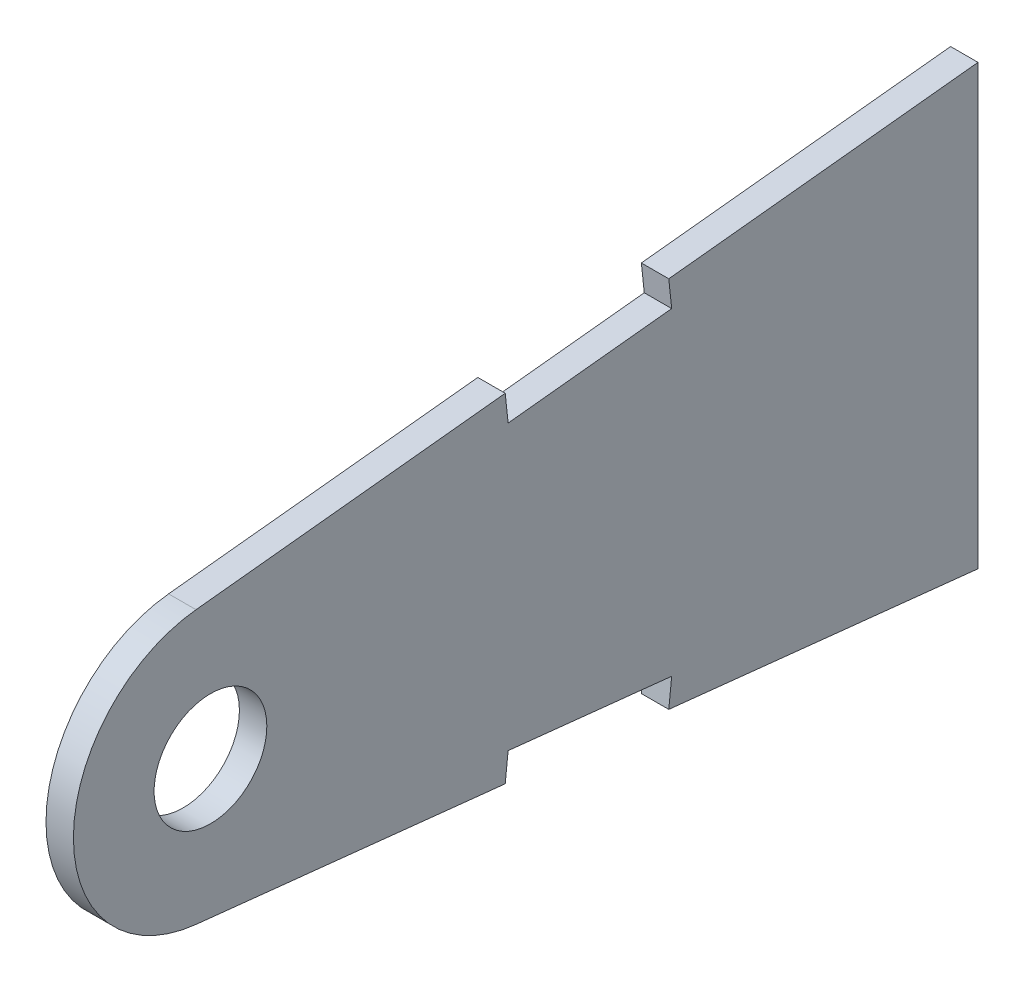
ISO-10303-21;
HEADER;
FILE_DESCRIPTION(('STEP AP214'),'2;1');
FILE_NAME('part.step','',(''),(''),'','','');
FILE_SCHEMA(('AUTOMOTIVE_DESIGN { 1 0 10303 214 1 1 1 1 }'));
ENDSEC;
DATA;
#1=APPLICATION_CONTEXT('core data for automotive mechanical design processes');
#2=APPLICATION_PROTOCOL_DEFINITION('international standard','automotive_design',2000,#1);
#3=PRODUCT_CONTEXT('',#1,'mechanical');
#4=PRODUCT('Part','Part','',(#3));
#5=PRODUCT_RELATED_PRODUCT_CATEGORY('part','',(#4));
#6=PRODUCT_DEFINITION_FORMATION('','',#4);
#7=PRODUCT_DEFINITION_CONTEXT('part definition',#1,'design');
#8=PRODUCT_DEFINITION('design','',#6,#7);
#9=PRODUCT_DEFINITION_SHAPE('','',#8);
#10=(LENGTH_UNIT() NAMED_UNIT(*) SI_UNIT(.MILLI.,.METRE.));
#11=(NAMED_UNIT(*) PLANE_ANGLE_UNIT() SI_UNIT($,.RADIAN.));
#12=(NAMED_UNIT(*) SI_UNIT($,.STERADIAN.) SOLID_ANGLE_UNIT());
#13=UNCERTAINTY_MEASURE_WITH_UNIT(LENGTH_MEASURE(1.E-05),#10,'distance_accuracy_value','');
#14=(GEOMETRIC_REPRESENTATION_CONTEXT(3) GLOBAL_UNCERTAINTY_ASSIGNED_CONTEXT((#13)) GLOBAL_UNIT_ASSIGNED_CONTEXT((#10,
#11,#12)) REPRESENTATION_CONTEXT('',''));
#15=CARTESIAN_POINT('',(0.,0.,0.));
#16=DIRECTION('',(0.,0.,1.));
#17=DIRECTION('',(1.,0.,0.));
#18=AXIS2_PLACEMENT_3D('',#15,#16,#17);
#19=CARTESIAN_POINT('',(1.5875,0.,0.));
#20=DIRECTION('',(-1.,0.,0.));
#21=DIRECTION('',(0.,0.,1.));
#22=AXIS2_PLACEMENT_3D('',#19,#20,#21);
#23=CYLINDRICAL_SURFACE('',#22,7.93750000000001);
#24=CARTESIAN_POINT('',(0.,0.,0.));
#25=DIRECTION('',(1.,0.,0.));
#26=DIRECTION('',(0.,0.,-1.));
#27=AXIS2_PLACEMENT_3D('',#24,#25,#26);
#28=CIRCLE('',#27,7.93750000000001);
#29=CARTESIAN_POINT('',(0.,7.89316367207392,0.837778906306832));
#30=VERTEX_POINT('',#29);
#31=CARTESIAN_POINT('',(0.,-7.89316367207392,0.837778906306832));
#32=VERTEX_POINT('',#31);
#33=EDGE_CURVE('E155',#30,#32,#28,.T.);
#34=ORIENTED_EDGE('',*,*,#33,.T.);
#35=DIRECTION('',(-1.,0.,0.));
#36=VECTOR('',#35,1.);
#37=CARTESIAN_POINT('',(1.5875,-7.89316367207392,0.837778906306832));
#38=LINE('',#37,#36);
#39=CARTESIAN_POINT('',(1.5875,-7.89316367207392,0.837778906306832));
#40=VERTEX_POINT('',#39);
#41=EDGE_CURVE('E11',#40,#32,#38,.T.);
#42=ORIENTED_EDGE('',*,*,#41,.F.);
#43=CARTESIAN_POINT('',(1.5875,0.,0.));
#44=DIRECTION('',(1.,0.,0.));
#45=DIRECTION('',(0.,0.,-1.));
#46=AXIS2_PLACEMENT_3D('',#43,#44,#45);
#47=CIRCLE('',#46,7.93750000000001);
#48=CARTESIAN_POINT('',(1.5875,7.89316367207392,0.837778906306832));
#49=VERTEX_POINT('',#48);
#50=EDGE_CURVE('E236',#49,#40,#47,.T.);
#51=ORIENTED_EDGE('',*,*,#50,.F.);
#52=DIRECTION('',(-1.,0.,0.));
#53=VECTOR('',#52,1.);
#54=CARTESIAN_POINT('',(1.5875,7.89316367207392,0.837778906306832));
#55=LINE('',#54,#53);
#56=EDGE_CURVE('E150',#49,#30,#55,.T.);
#57=ORIENTED_EDGE('',*,*,#56,.T.);
#58=EDGE_LOOP('',(#34,#42,#51,#57));
#59=FACE_BOUND('',#58,.T.);
#60=ADVANCED_FACE('F36',(#59),#23,.T.);
#61=CARTESIAN_POINT('',(1.5875,-7.89316367207392,0.837778906306831));
#62=DIRECTION('',(0.,0.994414320891202,-0.105546948826057));
#63=DIRECTION('',(0.,0.105546948826057,0.994414320891202));
#64=AXIS2_PLACEMENT_3D('',#61,#62,#63);
#65=PLANE('',#64);
#66=DIRECTION('',(0.,-0.105546948826057,-0.994414320891202));
#67=VECTOR('',#66,1.);
#68=CARTESIAN_POINT('',(0.,-7.89316367207392,0.837778906306831));
#69=LINE('',#68,#67);
#70=CARTESIAN_POINT('',(0.,-9.79391449225286,-17.0702123436022));
#71=VERTEX_POINT('',#70);
#72=EDGE_CURVE('E158',#32,#71,#69,.T.);
#73=ORIENTED_EDGE('',*,*,#72,.T.);
#74=DIRECTION('',(-1.,0.,0.));
#75=VECTOR('',#74,1.);
#76=CARTESIAN_POINT('',(1.5875,-9.79391449225286,-17.0702123436022));
#77=LINE('',#76,#75);
#78=CARTESIAN_POINT('',(1.5875,-9.79391449225286,-17.0702123436022));
#79=VERTEX_POINT('',#78);
#80=EDGE_CURVE('E44',#79,#71,#77,.T.);
#81=ORIENTED_EDGE('',*,*,#80,.F.);
#82=DIRECTION('',(0.,-0.105546948826057,-0.994414320891202));
#83=VECTOR('',#82,1.);
#84=CARTESIAN_POINT('',(1.5875,-7.89316367207392,0.837778906306831));
#85=LINE('',#84,#83);
#86=EDGE_CURVE('E103',#40,#79,#85,.T.);
#87=ORIENTED_EDGE('',*,*,#86,.F.);
#88=ORIENTED_EDGE('',*,*,#41,.T.);
#89=EDGE_LOOP('',(#73,#81,#87,#88));
#90=FACE_BOUND('',#89,.T.);
#91=ADVANCED_FACE('F261',(#90),#65,.F.);
#92=CARTESIAN_POINT('',(1.5875,-1.90075082017878,-17.907991249909));
#93=DIRECTION('',(0.,0.105546948826049,0.994414320891203));
#94=DIRECTION('',(0.,-0.994414320891203,0.105546948826049));
#95=AXIS2_PLACEMENT_3D('',#92,#93,#94);
#96=PLANE('',#95);
#97=DIRECTION('',(0.,0.994414320891203,-0.105546948826049));
#98=VECTOR('',#97,1.);
#99=CARTESIAN_POINT('',(0.,-1.90075082017878,-17.907991249909));
#100=LINE('',#99,#98);
#101=CARTESIAN_POINT('',(0.,-8.21528175783757,-17.2377681248636));
#102=VERTEX_POINT('',#101);
#103=EDGE_CURVE('E161',#71,#102,#100,.T.);
#104=ORIENTED_EDGE('',*,*,#103,.T.);
#105=DIRECTION('',(-1.,0.,0.));
#106=VECTOR('',#105,1.);
#107=CARTESIAN_POINT('',(1.5875,-8.21528175783757,-17.2377681248636));
#108=LINE('',#107,#106);
#109=CARTESIAN_POINT('',(1.5875,-8.21528175783757,-17.2377681248636));
#110=VERTEX_POINT('',#109);
#111=EDGE_CURVE('E196',#110,#102,#108,.T.);
#112=ORIENTED_EDGE('',*,*,#111,.F.);
#113=DIRECTION('',(0.,0.994414320891203,-0.105546948826049));
#114=VECTOR('',#113,1.);
#115=CARTESIAN_POINT('',(1.5875,-1.90075082017878,-17.907991249909));
#116=LINE('',#115,#114);
#117=EDGE_CURVE('E204',#79,#110,#116,.T.);
#118=ORIENTED_EDGE('',*,*,#117,.F.);
#119=ORIENTED_EDGE('',*,*,#80,.T.);
#120=EDGE_LOOP('',(#104,#112,#118,#119));
#121=FACE_BOUND('',#120,.T.);
#122=ADVANCED_FACE('F202',(#121),#96,.F.);
#123=CARTESIAN_POINT('',(1.5875,-6.31453093765863,0.670223125045412));
#124=DIRECTION('',(0.,0.994414320891202,-0.105546948826058));
#125=DIRECTION('',(0.,0.105546948826058,0.994414320891202));
#126=AXIS2_PLACEMENT_3D('',#123,#124,#125);
#127=PLANE('',#126);
#128=DIRECTION('',(0.,-0.105546948826058,-0.994414320891202));
#129=VECTOR('',#128,1.);
#130=CARTESIAN_POINT('',(0.,-6.31453093765863,0.670223125045412));
#131=LINE('',#130,#129);
#132=CARTESIAN_POINT('',(0.,-9.22061644540577,-26.7095645313523));
#133=VERTEX_POINT('',#132);
#134=EDGE_CURVE('E164',#102,#133,#131,.T.);
#135=ORIENTED_EDGE('',*,*,#134,.T.);
#136=DIRECTION('',(-1.,0.,0.));
#137=VECTOR('',#136,1.);
#138=CARTESIAN_POINT('',(1.5875,-9.22061644540577,-26.7095645313523));
#139=LINE('',#138,#137);
#140=CARTESIAN_POINT('',(1.5875,-9.22061644540577,-26.7095645313523));
#141=VERTEX_POINT('',#140);
#142=EDGE_CURVE('E194',#141,#133,#139,.T.);
#143=ORIENTED_EDGE('',*,*,#142,.F.);
#144=DIRECTION('',(0.,-0.105546948826058,-0.994414320891202));
#145=VECTOR('',#144,1.);
#146=CARTESIAN_POINT('',(1.5875,-6.31453093765863,0.670223125045412));
#147=LINE('',#146,#145);
#148=EDGE_CURVE('E216',#110,#141,#147,.T.);
#149=ORIENTED_EDGE('',*,*,#148,.F.);
#150=ORIENTED_EDGE('',*,*,#111,.T.);
#151=EDGE_LOOP('',(#135,#143,#149,#150));
#152=FACE_BOUND('',#151,.T.);
#153=ADVANCED_FACE('F213',(#152),#127,.F.);
#154=CARTESIAN_POINT('',(1.5875,-2.90608550774707,-27.3797876563977));
#155=DIRECTION('',(0.,0.105546948826055,0.994414320891202));
#156=DIRECTION('',(0.,-0.994414320891202,0.105546948826055));
#157=AXIS2_PLACEMENT_3D('',#154,#155,#156);
#158=PLANE('',#157);
#159=DIRECTION('',(0.,0.994414320891202,-0.105546948826055));
#160=VECTOR('',#159,1.);
#161=CARTESIAN_POINT('',(0.,-2.90608550774707,-27.3797876563977));
#162=LINE('',#161,#160);
#163=CARTESIAN_POINT('',(0.,-10.7992491798211,-26.5420087500909));
#164=VERTEX_POINT('',#163);
#165=EDGE_CURVE('E167',#164,#133,#162,.T.);
#166=ORIENTED_EDGE('',*,*,#165,.F.);
#167=DIRECTION('',(-1.,0.,0.));
#168=VECTOR('',#167,1.);
#169=CARTESIAN_POINT('',(1.5875,-10.7992491798211,-26.5420087500909));
#170=LINE('',#169,#168);
#171=CARTESIAN_POINT('',(1.5875,-10.7992491798211,-26.5420087500909));
#172=VERTEX_POINT('',#171);
#173=EDGE_CURVE('E192',#172,#164,#170,.T.);
#174=ORIENTED_EDGE('',*,*,#173,.F.);
#175=DIRECTION('',(0.,0.994414320891202,-0.105546948826055));
#176=VECTOR('',#175,1.);
#177=CARTESIAN_POINT('',(1.5875,-2.90608550774707,-27.3797876563977));
#178=LINE('',#177,#176);
#179=EDGE_CURVE('E218',#172,#141,#178,.T.);
#180=ORIENTED_EDGE('',*,*,#179,.T.);
#181=ORIENTED_EDGE('',*,*,#142,.T.);
#182=EDGE_LOOP('',(#166,#174,#180,#181));
#183=FACE_BOUND('',#182,.T.);
#184=ADVANCED_FACE('F275',(#183),#158,.T.);
#185=CARTESIAN_POINT('',(0.,-12.7,-44.45));
#186=VERTEX_POINT('',#185);
#187=EDGE_CURVE('E162',#164,#186,#69,.T.);
#188=ORIENTED_EDGE('',*,*,#187,.T.);
#189=DIRECTION('',(-1.,0.,0.));
#190=VECTOR('',#189,1.);
#191=CARTESIAN_POINT('',(1.5875,-12.7,-44.45));
#192=LINE('',#191,#190);
#193=CARTESIAN_POINT('',(1.5875,-12.7,-44.45));
#194=VERTEX_POINT('',#193);
#195=EDGE_CURVE('E189',#194,#186,#192,.T.);
#196=ORIENTED_EDGE('',*,*,#195,.F.);
#197=EDGE_CURVE('E220',#172,#194,#85,.T.);
#198=ORIENTED_EDGE('',*,*,#197,.F.);
#199=ORIENTED_EDGE('',*,*,#173,.T.);
#200=EDGE_LOOP('',(#188,#196,#198,#199));
#201=FACE_BOUND('',#200,.T.);
#202=ADVANCED_FACE('F267',(#201),#65,.F.);
#203=CARTESIAN_POINT('',(1.5875,0.,-44.45));
#204=DIRECTION('',(0.,0.,1.));
#205=DIRECTION('',(1.,0.,0.));
#206=AXIS2_PLACEMENT_3D('',#203,#204,#205);
#207=PLANE('',#206);
#208=DIRECTION('',(0.,1.,0.));
#209=VECTOR('',#208,1.);
#210=CARTESIAN_POINT('',(0.,0.,-44.45));
#211=LINE('',#210,#209);
#212=CARTESIAN_POINT('',(0.,12.7,-44.45));
#213=VERTEX_POINT('',#212);
#214=EDGE_CURVE('E170',#186,#213,#211,.T.);
#215=ORIENTED_EDGE('',*,*,#214,.T.);
#216=DIRECTION('',(-1.,0.,0.));
#217=VECTOR('',#216,1.);
#218=CARTESIAN_POINT('',(1.5875,12.7,-44.45));
#219=LINE('',#218,#217);
#220=CARTESIAN_POINT('',(1.5875,12.7,-44.45));
#221=VERTEX_POINT('',#220);
#222=EDGE_CURVE('E186',#221,#213,#219,.T.);
#223=ORIENTED_EDGE('',*,*,#222,.F.);
#224=DIRECTION('',(0.,1.,0.));
#225=VECTOR('',#224,1.);
#226=CARTESIAN_POINT('',(1.5875,0.,-44.45));
#227=LINE('',#226,#225);
#228=EDGE_CURVE('E225',#194,#221,#227,.T.);
#229=ORIENTED_EDGE('',*,*,#228,.F.);
#230=ORIENTED_EDGE('',*,*,#195,.T.);
#231=EDGE_LOOP('',(#215,#223,#229,#230));
#232=FACE_BOUND('',#231,.T.);
#233=ADVANCED_FACE('F274',(#232),#207,.F.);
#234=CARTESIAN_POINT('',(1.5875,7.89316367207392,0.837778906306831));
#235=DIRECTION('',(0.,-0.994414320891202,-0.105546948826057));
#236=DIRECTION('',(0.,0.105546948826057,-0.994414320891202));
#237=AXIS2_PLACEMENT_3D('',#234,#235,#236);
#238=PLANE('',#237);
#239=DIRECTION('',(0.,-0.105546948826057,0.994414320891202));
#240=VECTOR('',#239,1.);
#241=CARTESIAN_POINT('',(0.,7.89316367207392,0.837778906306831));
#242=LINE('',#241,#240);
#243=CARTESIAN_POINT('',(0.,10.7992491798211,-26.5420087500909));
#244=VERTEX_POINT('',#243);
#245=EDGE_CURVE('E172',#213,#244,#242,.T.);
#246=ORIENTED_EDGE('',*,*,#245,.T.);
#247=DIRECTION('',(-1.,0.,0.));
#248=VECTOR('',#247,1.);
#249=CARTESIAN_POINT('',(1.5875,10.7992491798211,-26.5420087500909));
#250=LINE('',#249,#248);
#251=CARTESIAN_POINT('',(1.5875,10.7992491798211,-26.5420087500909));
#252=VERTEX_POINT('',#251);
#253=EDGE_CURVE('E183',#252,#244,#250,.T.);
#254=ORIENTED_EDGE('',*,*,#253,.F.);
#255=DIRECTION('',(0.,-0.105546948826057,0.994414320891202));
#256=VECTOR('',#255,1.);
#257=CARTESIAN_POINT('',(1.5875,7.89316367207392,0.837778906306831));
#258=LINE('',#257,#256);
#259=EDGE_CURVE('E152',#221,#252,#258,.T.);
#260=ORIENTED_EDGE('',*,*,#259,.F.);
#261=ORIENTED_EDGE('',*,*,#222,.T.);
#262=EDGE_LOOP('',(#246,#254,#260,#261));
#263=FACE_BOUND('',#262,.T.);
#264=ADVANCED_FACE('F231',(#263),#238,.F.);
#265=CARTESIAN_POINT('',(1.5875,2.90608550774721,-27.3797876563978));
#266=DIRECTION('',(0.,0.10554694882606,-0.994414320891201));
#267=DIRECTION('',(0.,0.994414320891201,0.10554694882606));
#268=AXIS2_PLACEMENT_3D('',#265,#266,#267);
#269=PLANE('',#268);
#270=DIRECTION('',(0.,-0.994414320891201,-0.10554694882606));
#271=VECTOR('',#270,1.);
#272=CARTESIAN_POINT('',(0.,2.90608550774721,-27.3797876563978));
#273=LINE('',#272,#271);
#274=CARTESIAN_POINT('',(0.,9.22061644540577,-26.7095645313524));
#275=VERTEX_POINT('',#274);
#276=EDGE_CURVE('E174',#244,#275,#273,.T.);
#277=ORIENTED_EDGE('',*,*,#276,.T.);
#278=DIRECTION('',(-1.,0.,0.));
#279=VECTOR('',#278,1.);
#280=CARTESIAN_POINT('',(1.5875,9.22061644540577,-26.7095645313524));
#281=LINE('',#280,#279);
#282=CARTESIAN_POINT('',(1.5875,9.22061644540577,-26.7095645313524));
#283=VERTEX_POINT('',#282);
#284=EDGE_CURVE('E140',#283,#275,#281,.T.);
#285=ORIENTED_EDGE('',*,*,#284,.F.);
#286=DIRECTION('',(0.,-0.994414320891201,-0.10554694882606));
#287=VECTOR('',#286,1.);
#288=CARTESIAN_POINT('',(1.5875,2.90608550774721,-27.3797876563978));
#289=LINE('',#288,#287);
#290=EDGE_CURVE('E145',#252,#283,#289,.T.);
#291=ORIENTED_EDGE('',*,*,#290,.F.);
#292=ORIENTED_EDGE('',*,*,#253,.T.);
#293=EDGE_LOOP('',(#277,#285,#291,#292));
#294=FACE_BOUND('',#293,.T.);
#295=ADVANCED_FACE('F235',(#294),#269,.F.);
#296=CARTESIAN_POINT('',(1.5875,6.31453093765862,0.670223125045413));
#297=DIRECTION('',(0.,0.994414320891202,0.105546948826058));
#298=DIRECTION('',(0.,-0.105546948826058,0.994414320891202));
#299=AXIS2_PLACEMENT_3D('',#296,#297,#298);
#300=PLANE('',#299);
#301=DIRECTION('',(0.,0.105546948826058,-0.994414320891202));
#302=VECTOR('',#301,1.);
#303=CARTESIAN_POINT('',(0.,6.31453093765862,0.670223125045413));
#304=LINE('',#303,#302);
#305=CARTESIAN_POINT('',(0.,8.21528175783757,-17.2377681248637));
#306=VERTEX_POINT('',#305);
#307=EDGE_CURVE('E135',#306,#275,#304,.T.);
#308=ORIENTED_EDGE('',*,*,#307,.F.);
#309=DIRECTION('',(-1.,0.,0.));
#310=VECTOR('',#309,1.);
#311=CARTESIAN_POINT('',(1.5875,8.21528175783757,-17.2377681248637));
#312=LINE('',#311,#310);
#313=CARTESIAN_POINT('',(1.5875,8.21528175783757,-17.2377681248637));
#314=VERTEX_POINT('',#313);
#315=EDGE_CURVE('E130',#314,#306,#312,.T.);
#316=ORIENTED_EDGE('',*,*,#315,.F.);
#317=DIRECTION('',(0.,0.105546948826058,-0.994414320891202));
#318=VECTOR('',#317,1.);
#319=CARTESIAN_POINT('',(1.5875,6.31453093765862,0.670223125045413));
#320=LINE('',#319,#318);
#321=EDGE_CURVE('E133',#314,#283,#320,.T.);
#322=ORIENTED_EDGE('',*,*,#321,.T.);
#323=ORIENTED_EDGE('',*,*,#284,.T.);
#324=EDGE_LOOP('',(#308,#316,#322,#323));
#325=FACE_BOUND('',#324,.T.);
#326=ADVANCED_FACE('F132',(#325),#300,.T.);
#327=CARTESIAN_POINT('',(1.5875,1.90075082017886,-17.907991249909));
#328=DIRECTION('',(0.,0.105546948826053,-0.994414320891202));
#329=DIRECTION('',(0.,0.994414320891202,0.105546948826053));
#330=AXIS2_PLACEMENT_3D('',#327,#328,#329);
#331=PLANE('',#330);
#332=DIRECTION('',(0.,-0.994414320891202,-0.105546948826053));
#333=VECTOR('',#332,1.);
#334=CARTESIAN_POINT('',(0.,1.90075082017886,-17.907991249909));
#335=LINE('',#334,#333);
#336=CARTESIAN_POINT('',(0.,9.79391449225287,-17.0702123436022));
#337=VERTEX_POINT('',#336);
#338=EDGE_CURVE('E178',#337,#306,#335,.T.);
#339=ORIENTED_EDGE('',*,*,#338,.F.);
#340=DIRECTION('',(-1.,0.,0.));
#341=VECTOR('',#340,1.);
#342=CARTESIAN_POINT('',(1.5875,9.79391449225287,-17.0702123436022));
#343=LINE('',#342,#341);
#344=CARTESIAN_POINT('',(1.5875,9.79391449225287,-17.0702123436022));
#345=VERTEX_POINT('',#344);
#346=EDGE_CURVE('E92',#345,#337,#343,.T.);
#347=ORIENTED_EDGE('',*,*,#346,.F.);
#348=DIRECTION('',(0.,-0.994414320891202,-0.105546948826053));
#349=VECTOR('',#348,1.);
#350=CARTESIAN_POINT('',(1.5875,1.90075082017886,-17.907991249909));
#351=LINE('',#350,#349);
#352=EDGE_CURVE('E143',#345,#314,#351,.T.);
#353=ORIENTED_EDGE('',*,*,#352,.T.);
#354=ORIENTED_EDGE('',*,*,#315,.T.);
#355=EDGE_LOOP('',(#339,#347,#353,#354));
#356=FACE_BOUND('',#355,.T.);
#357=ADVANCED_FACE('F148',(#356),#331,.T.);
#358=EDGE_CURVE('E95',#337,#30,#242,.T.);
#359=ORIENTED_EDGE('',*,*,#358,.T.);
#360=ORIENTED_EDGE('',*,*,#56,.F.);
#361=EDGE_CURVE('E52',#345,#49,#258,.T.);
#362=ORIENTED_EDGE('',*,*,#361,.F.);
#363=ORIENTED_EDGE('',*,*,#346,.T.);
#364=EDGE_LOOP('',(#359,#360,#362,#363));
#365=FACE_BOUND('',#364,.T.);
#366=ADVANCED_FACE('F250',(#365),#238,.F.);
#367=CARTESIAN_POINT('',(1.5875,0.,0.));
#368=DIRECTION('',(1.,0.,0.));
#369=DIRECTION('',(0.,0.,-1.));
#370=AXIS2_PLACEMENT_3D('',#367,#368,#369);
#371=PLANE('',#370);
#372=CARTESIAN_POINT('',(1.5875,0.,0.));
#373=DIRECTION('',(1.,0.,0.));
#374=DIRECTION('',(0.,0.,-1.));
#375=AXIS2_PLACEMENT_3D('',#372,#373,#374);
#376=CIRCLE('',#375,3.2639);
#377=CARTESIAN_POINT('',(1.5875,0.,-3.2639));
#378=VERTEX_POINT('',#377);
#379=EDGE_CURVE('E243',#378,#378,#376,.T.);
#380=ORIENTED_EDGE('',*,*,#379,.F.);
#381=EDGE_LOOP('',(#380));
#382=FACE_BOUND('',#381,.T.);
#383=ORIENTED_EDGE('',*,*,#50,.T.);
#384=ORIENTED_EDGE('',*,*,#86,.T.);
#385=ORIENTED_EDGE('',*,*,#117,.T.);
#386=ORIENTED_EDGE('',*,*,#148,.T.);
#387=ORIENTED_EDGE('',*,*,#179,.F.);
#388=ORIENTED_EDGE('',*,*,#197,.T.);
#389=ORIENTED_EDGE('',*,*,#228,.T.);
#390=ORIENTED_EDGE('',*,*,#259,.T.);
#391=ORIENTED_EDGE('',*,*,#290,.T.);
#392=ORIENTED_EDGE('',*,*,#321,.F.);
#393=ORIENTED_EDGE('',*,*,#352,.F.);
#394=ORIENTED_EDGE('',*,*,#361,.T.);
#395=EDGE_LOOP('',(#383,#384,#385,#386,#387,#388,#389,#390,#391,#392,#393,#394));
#396=FACE_BOUND('',#395,.T.);
#397=ADVANCED_FACE('F142',(#382,#396),#371,.T.);
#398=CARTESIAN_POINT('',(0.,0.,0.));
#399=DIRECTION('',(1.,0.,0.));
#400=DIRECTION('',(0.,0.,-1.));
#401=AXIS2_PLACEMENT_3D('',#398,#399,#400);
#402=PLANE('',#401);
#403=CARTESIAN_POINT('',(0.,0.,0.));
#404=DIRECTION('',(1.,0.,0.));
#405=DIRECTION('',(0.,0.,-1.));
#406=AXIS2_PLACEMENT_3D('',#403,#404,#405);
#407=CIRCLE('',#406,3.2639);
#408=CARTESIAN_POINT('',(0.,0.,-3.2639));
#409=VERTEX_POINT('',#408);
#410=EDGE_CURVE('E159',#409,#409,#407,.T.);
#411=ORIENTED_EDGE('',*,*,#410,.T.);
#412=EDGE_LOOP('',(#411));
#413=FACE_BOUND('',#412,.T.);
#414=ORIENTED_EDGE('',*,*,#33,.F.);
#415=ORIENTED_EDGE('',*,*,#358,.F.);
#416=ORIENTED_EDGE('',*,*,#338,.T.);
#417=ORIENTED_EDGE('',*,*,#307,.T.);
#418=ORIENTED_EDGE('',*,*,#276,.F.);
#419=ORIENTED_EDGE('',*,*,#245,.F.);
#420=ORIENTED_EDGE('',*,*,#214,.F.);
#421=ORIENTED_EDGE('',*,*,#187,.F.);
#422=ORIENTED_EDGE('',*,*,#165,.T.);
#423=ORIENTED_EDGE('',*,*,#134,.F.);
#424=ORIENTED_EDGE('',*,*,#103,.F.);
#425=ORIENTED_EDGE('',*,*,#72,.F.);
#426=EDGE_LOOP('',(#414,#415,#416,#417,#418,#419,#420,#421,#422,#423,#424,#425));
#427=FACE_BOUND('',#426,.T.);
#428=ADVANCED_FACE('F208',(#413,#427),#402,.F.);
#429=CARTESIAN_POINT('',(1.5875,0.,0.));
#430=DIRECTION('',(1.,0.,0.));
#431=DIRECTION('',(0.,0.,-1.));
#432=AXIS2_PLACEMENT_3D('',#429,#430,#431);
#433=CYLINDRICAL_SURFACE('',#432,3.2639);
#434=ORIENTED_EDGE('',*,*,#410,.F.);
#435=EDGE_LOOP('',(#434));
#436=FACE_BOUND('',#435,.T.);
#437=ORIENTED_EDGE('',*,*,#379,.T.);
#438=EDGE_LOOP('',(#437));
#439=FACE_BOUND('',#438,.T.);
#440=ADVANCED_FACE('F247',(#436,#439),#433,.F.);
#441=CLOSED_SHELL('',(#60,#91,#122,#153,#184,#202,#233,#264,#295,#326,#357,#366,#397,#428,#440));
#442=MANIFOLD_SOLID_BREP('B2',#441);
#443=ADVANCED_BREP_SHAPE_REPRESENTATION('',(#18,#442),#14);
#444=SHAPE_DEFINITION_REPRESENTATION(#9,#443);
ENDSEC;
END-ISO-10303-21;
